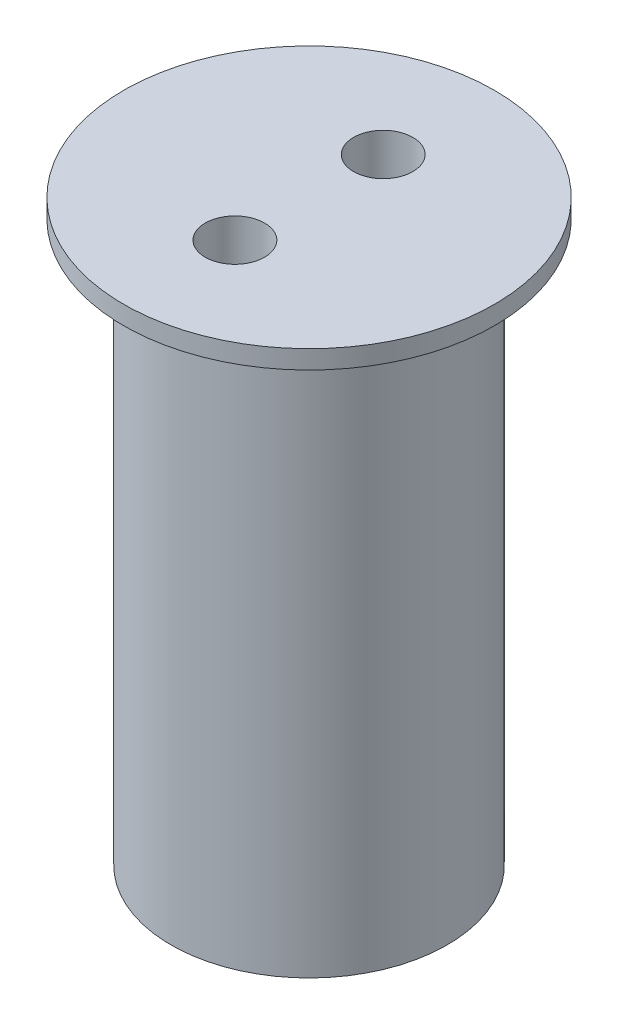
ISO-10303-21;
HEADER;
FILE_DESCRIPTION(('STEP AP214'),'2;1');
FILE_NAME('part.step','',(''),(''),'','','');
FILE_SCHEMA(('AUTOMOTIVE_DESIGN { 1 0 10303 214 1 1 1 1 }'));
ENDSEC;
DATA;
#1=APPLICATION_CONTEXT('core data for automotive mechanical design processes');
#2=APPLICATION_PROTOCOL_DEFINITION('international standard','automotive_design',2000,#1);
#3=PRODUCT_CONTEXT('',#1,'mechanical');
#4=PRODUCT('Part','Part','',(#3));
#5=PRODUCT_RELATED_PRODUCT_CATEGORY('part','',(#4));
#6=PRODUCT_DEFINITION_FORMATION('','',#4);
#7=PRODUCT_DEFINITION_CONTEXT('part definition',#1,'design');
#8=PRODUCT_DEFINITION('design','',#6,#7);
#9=PRODUCT_DEFINITION_SHAPE('','',#8);
#10=(LENGTH_UNIT() NAMED_UNIT(*) SI_UNIT(.MILLI.,.METRE.));
#11=(NAMED_UNIT(*) PLANE_ANGLE_UNIT() SI_UNIT($,.RADIAN.));
#12=(NAMED_UNIT(*) SI_UNIT($,.STERADIAN.) SOLID_ANGLE_UNIT());
#13=UNCERTAINTY_MEASURE_WITH_UNIT(LENGTH_MEASURE(1.E-05),#10,'distance_accuracy_value','');
#14=(GEOMETRIC_REPRESENTATION_CONTEXT(3) GLOBAL_UNCERTAINTY_ASSIGNED_CONTEXT((#13)) GLOBAL_UNIT_ASSIGNED_CONTEXT((#10,
#11,#12)) REPRESENTATION_CONTEXT('',''));
#15=CARTESIAN_POINT('',(0.,0.,0.));
#16=DIRECTION('',(0.,0.,1.));
#17=DIRECTION('',(1.,0.,0.));
#18=AXIS2_PLACEMENT_3D('',#15,#16,#17);
#19=CARTESIAN_POINT('',(0.,14.96953125,0.));
#20=DIRECTION('',(0.,1.,0.));
#21=DIRECTION('',(0.,0.,1.));
#22=AXIS2_PLACEMENT_3D('',#19,#20,#21);
#23=PLANE('',#22);
#24=CARTESIAN_POINT('',(0.,14.96953125,4.));
#25=DIRECTION('',(0.,1.,0.));
#26=DIRECTION('',(0.,0.,1.));
#27=AXIS2_PLACEMENT_3D('',#24,#25,#26);
#28=CIRCLE('',#27,1.6);
#29=CARTESIAN_POINT('',(0.,14.96953125,5.6));
#30=VERTEX_POINT('',#29);
#31=EDGE_CURVE('E70',#30,#30,#28,.T.);
#32=ORIENTED_EDGE('',*,*,#31,.F.);
#33=EDGE_LOOP('',(#32));
#34=FACE_BOUND('',#33,.T.);
#35=CARTESIAN_POINT('',(0.,14.96953125,-4.));
#36=DIRECTION('',(0.,1.,0.));
#37=DIRECTION('',(0.,0.,1.));
#38=AXIS2_PLACEMENT_3D('',#35,#36,#37);
#39=CIRCLE('',#38,1.6);
#40=CARTESIAN_POINT('',(0.,14.96953125,-2.4));
#41=VERTEX_POINT('',#40);
#42=EDGE_CURVE('E72',#41,#41,#39,.T.);
#43=ORIENTED_EDGE('',*,*,#42,.F.);
#44=EDGE_LOOP('',(#43));
#45=FACE_BOUND('',#44,.T.);
#46=CARTESIAN_POINT('',(0.,14.96953125,0.));
#47=DIRECTION('',(0.,-1.,0.));
#48=DIRECTION('',(0.,0.,-1.));
#49=AXIS2_PLACEMENT_3D('',#46,#47,#48);
#50=CIRCLE('',#49,10.);
#51=CARTESIAN_POINT('',(0.,14.96953125,-10.));
#52=VERTEX_POINT('',#51);
#53=EDGE_CURVE('E10',#52,#52,#50,.T.);
#54=ORIENTED_EDGE('',*,*,#53,.F.);
#55=EDGE_LOOP('',(#54));
#56=FACE_BOUND('',#55,.T.);
#57=ADVANCED_FACE('F43',(#34,#45,#56),#23,.T.);
#58=CARTESIAN_POINT('',(0.,-16.23046875,0.));
#59=DIRECTION('',(0.,-1.,0.));
#60=DIRECTION('',(0.,0.,-1.));
#61=AXIS2_PLACEMENT_3D('',#58,#59,#60);
#62=CYLINDRICAL_SURFACE('',#61,10.);
#63=ORIENTED_EDGE('',*,*,#53,.T.);
#64=EDGE_LOOP('',(#63));
#65=FACE_BOUND('',#64,.T.);
#66=CARTESIAN_POINT('',(0.,13.96953125,0.));
#67=DIRECTION('',(0.,-1.,0.));
#68=DIRECTION('',(0.,0.,-1.));
#69=AXIS2_PLACEMENT_3D('',#66,#67,#68);
#70=CIRCLE('',#69,10.);
#71=CARTESIAN_POINT('',(0.,13.96953125,-10.));
#72=VERTEX_POINT('',#71);
#73=EDGE_CURVE('E49',#72,#72,#70,.T.);
#74=ORIENTED_EDGE('',*,*,#73,.F.);
#75=EDGE_LOOP('',(#74));
#76=FACE_BOUND('',#75,.T.);
#77=ADVANCED_FACE('F103',(#65,#76),#62,.T.);
#78=CARTESIAN_POINT('',(10.,13.96953125,0.));
#79=DIRECTION('',(0.,-1.,0.));
#80=DIRECTION('',(0.,0.,-1.));
#81=AXIS2_PLACEMENT_3D('',#78,#79,#80);
#82=PLANE('',#81);
#83=ORIENTED_EDGE('',*,*,#73,.T.);
#84=EDGE_LOOP('',(#83));
#85=FACE_BOUND('',#84,.T.);
#86=CARTESIAN_POINT('',(0.,13.96953125,0.));
#87=DIRECTION('',(0.,-1.,0.));
#88=DIRECTION('',(0.,0.,-1.));
#89=AXIS2_PLACEMENT_3D('',#86,#87,#88);
#90=CIRCLE('',#89,7.45);
#91=CARTESIAN_POINT('',(0.,13.96953125,-7.45));
#92=VERTEX_POINT('',#91);
#93=EDGE_CURVE('E60',#92,#92,#90,.T.);
#94=ORIENTED_EDGE('',*,*,#93,.F.);
#95=EDGE_LOOP('',(#94));
#96=FACE_BOUND('',#95,.T.);
#97=ADVANCED_FACE('F98',(#85,#96),#82,.T.);
#98=CARTESIAN_POINT('',(0.,-16.23046875,0.));
#99=DIRECTION('',(0.,-1.,0.));
#100=DIRECTION('',(0.,0.,-1.));
#101=AXIS2_PLACEMENT_3D('',#98,#99,#100);
#102=CYLINDRICAL_SURFACE('',#101,7.45);
#103=ORIENTED_EDGE('',*,*,#93,.T.);
#104=EDGE_LOOP('',(#103));
#105=FACE_BOUND('',#104,.T.);
#106=CARTESIAN_POINT('',(0.,-16.23046875,0.));
#107=DIRECTION('',(0.,-1.,0.));
#108=DIRECTION('',(0.,0.,-1.));
#109=AXIS2_PLACEMENT_3D('',#106,#107,#108);
#110=CIRCLE('',#109,7.45);
#111=CARTESIAN_POINT('',(0.,-16.23046875,-7.45));
#112=VERTEX_POINT('',#111);
#113=EDGE_CURVE('E64',#112,#112,#110,.T.);
#114=ORIENTED_EDGE('',*,*,#113,.F.);
#115=EDGE_LOOP('',(#114));
#116=FACE_BOUND('',#115,.T.);
#117=ADVANCED_FACE('F90',(#105,#116),#102,.T.);
#118=CARTESIAN_POINT('',(7.45,-16.23046875,0.));
#119=DIRECTION('',(0.,-1.,0.));
#120=DIRECTION('',(0.,0.,-1.));
#121=AXIS2_PLACEMENT_3D('',#118,#119,#120);
#122=PLANE('',#121);
#123=CARTESIAN_POINT('',(0.,-16.23046875,4.));
#124=DIRECTION('',(0.,-1.,0.));
#125=DIRECTION('',(0.,0.,-1.));
#126=AXIS2_PLACEMENT_3D('',#123,#124,#125);
#127=CIRCLE('',#126,1.6);
#128=CARTESIAN_POINT('',(0.,-16.23046875,2.4));
#129=VERTEX_POINT('',#128);
#130=EDGE_CURVE('E77',#129,#129,#127,.T.);
#131=ORIENTED_EDGE('',*,*,#130,.F.);
#132=EDGE_LOOP('',(#131));
#133=FACE_BOUND('',#132,.T.);
#134=CARTESIAN_POINT('',(0.,-16.23046875,-4.));
#135=DIRECTION('',(0.,-1.,0.));
#136=DIRECTION('',(0.,0.,-1.));
#137=AXIS2_PLACEMENT_3D('',#134,#135,#136);
#138=CIRCLE('',#137,1.6);
#139=CARTESIAN_POINT('',(0.,-16.23046875,-5.6));
#140=VERTEX_POINT('',#139);
#141=EDGE_CURVE('E80',#140,#140,#138,.T.);
#142=ORIENTED_EDGE('',*,*,#141,.F.);
#143=EDGE_LOOP('',(#142));
#144=FACE_BOUND('',#143,.T.);
#145=ORIENTED_EDGE('',*,*,#113,.T.);
#146=EDGE_LOOP('',(#145));
#147=FACE_BOUND('',#146,.T.);
#148=ADVANCED_FACE('F83',(#133,#144,#147),#122,.T.);
#149=CARTESIAN_POINT('',(0.,19.76953125,-4.));
#150=DIRECTION('',(0.,-1.,0.));
#151=DIRECTION('',(0.,0.,-1.));
#152=AXIS2_PLACEMENT_3D('',#149,#150,#151);
#153=CYLINDRICAL_SURFACE('',#152,1.6);
#154=ORIENTED_EDGE('',*,*,#42,.T.);
#155=EDGE_LOOP('',(#154));
#156=FACE_BOUND('',#155,.T.);
#157=ORIENTED_EDGE('',*,*,#141,.T.);
#158=EDGE_LOOP('',(#157));
#159=FACE_BOUND('',#158,.T.);
#160=ADVANCED_FACE('F87',(#156,#159),#153,.F.);
#161=CARTESIAN_POINT('',(0.,19.76953125,4.));
#162=DIRECTION('',(0.,-1.,0.));
#163=DIRECTION('',(0.,0.,-1.));
#164=AXIS2_PLACEMENT_3D('',#161,#162,#163);
#165=CYLINDRICAL_SURFACE('',#164,1.6);
#166=ORIENTED_EDGE('',*,*,#31,.T.);
#167=EDGE_LOOP('',(#166));
#168=FACE_BOUND('',#167,.T.);
#169=ORIENTED_EDGE('',*,*,#130,.T.);
#170=EDGE_LOOP('',(#169));
#171=FACE_BOUND('',#170,.T.);
#172=ADVANCED_FACE('F84',(#168,#171),#165,.F.);
#173=CLOSED_SHELL('',(#57,#77,#97,#117,#148,#160,#172));
#174=MANIFOLD_SOLID_BREP('B2',#173);
#175=ADVANCED_BREP_SHAPE_REPRESENTATION('',(#18,#174),#14);
#176=SHAPE_DEFINITION_REPRESENTATION(#9,#175);
ENDSEC;
END-ISO-10303-21;
